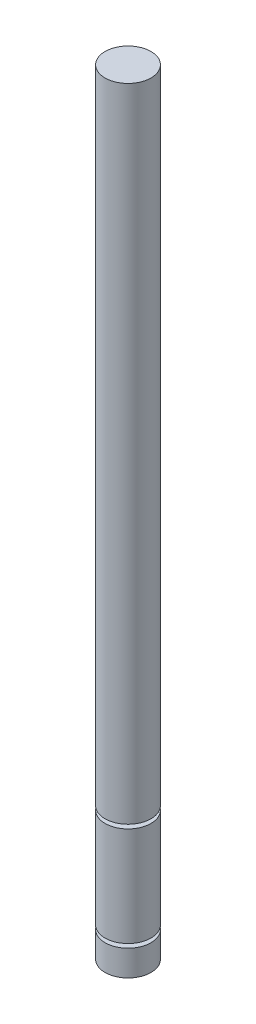
ISO-10303-21;
HEADER;
FILE_DESCRIPTION(('STEP AP214'),'2;1');
FILE_NAME('part.step','',(''),(''),'','','');
FILE_SCHEMA(('AUTOMOTIVE_DESIGN { 1 0 10303 214 1 1 1 1 }'));
ENDSEC;
DATA;
#1=APPLICATION_CONTEXT('core data for automotive mechanical design processes');
#2=APPLICATION_PROTOCOL_DEFINITION('international standard','automotive_design',2000,#1);
#3=PRODUCT_CONTEXT('',#1,'mechanical');
#4=PRODUCT('Part','Part','',(#3));
#5=PRODUCT_RELATED_PRODUCT_CATEGORY('part','',(#4));
#6=PRODUCT_DEFINITION_FORMATION('','',#4);
#7=PRODUCT_DEFINITION_CONTEXT('part definition',#1,'design');
#8=PRODUCT_DEFINITION('design','',#6,#7);
#9=PRODUCT_DEFINITION_SHAPE('','',#8);
#10=(LENGTH_UNIT() NAMED_UNIT(*) SI_UNIT(.MILLI.,.METRE.));
#11=(NAMED_UNIT(*) PLANE_ANGLE_UNIT() SI_UNIT($,.RADIAN.));
#12=(NAMED_UNIT(*) SI_UNIT($,.STERADIAN.) SOLID_ANGLE_UNIT());
#13=UNCERTAINTY_MEASURE_WITH_UNIT(LENGTH_MEASURE(1.E-05),#10,'distance_accuracy_value','');
#14=(GEOMETRIC_REPRESENTATION_CONTEXT(3) GLOBAL_UNCERTAINTY_ASSIGNED_CONTEXT((#13)) GLOBAL_UNIT_ASSIGNED_CONTEXT((#10,
#11,#12)) REPRESENTATION_CONTEXT('',''));
#15=CARTESIAN_POINT('',(0.,0.,0.));
#16=DIRECTION('',(0.,0.,1.));
#17=DIRECTION('',(1.,0.,0.));
#18=AXIS2_PLACEMENT_3D('',#15,#16,#17);
#19=CARTESIAN_POINT('',(0.,135.,0.));
#20=DIRECTION('',(0.,-1.,0.));
#21=DIRECTION('',(0.,0.,-1.));
#22=AXIS2_PLACEMENT_3D('',#19,#20,#21);
#23=CYLINDRICAL_SURFACE('',#22,4.);
#24=CARTESIAN_POINT('',(0.,5.20000000000001,0.));
#25=DIRECTION('',(0.,-1.,0.));
#26=DIRECTION('',(0.,0.,-1.));
#27=AXIS2_PLACEMENT_3D('',#24,#25,#26);
#28=CIRCLE('',#27,4.);
#29=CARTESIAN_POINT('',(0.,5.20000000000001,-4.));
#30=VERTEX_POINT('',#29);
#31=EDGE_CURVE('E57',#30,#30,#28,.T.);
#32=ORIENTED_EDGE('',*,*,#31,.F.);
#33=EDGE_LOOP('',(#32));
#34=FACE_BOUND('',#33,.T.);
#35=CARTESIAN_POINT('',(0.,22.5,0.));
#36=DIRECTION('',(0.,-1.,0.));
#37=DIRECTION('',(0.,0.,-1.));
#38=AXIS2_PLACEMENT_3D('',#35,#36,#37);
#39=CIRCLE('',#38,3.99999999999998);
#40=CARTESIAN_POINT('',(0.,22.5,-3.99999999999998));
#41=VERTEX_POINT('',#40);
#42=EDGE_CURVE('E60',#41,#41,#39,.T.);
#43=ORIENTED_EDGE('',*,*,#42,.T.);
#44=EDGE_LOOP('',(#43));
#45=FACE_BOUND('',#44,.T.);
#46=ADVANCED_FACE('F36',(#34,#45),#23,.T.);
#47=CARTESIAN_POINT('',(0.,0.,0.));
#48=DIRECTION('',(0.,1.,0.));
#49=DIRECTION('',(0.,0.,1.));
#50=AXIS2_PLACEMENT_3D('',#47,#48,#49);
#51=CIRCLE('',#50,4.);
#52=CARTESIAN_POINT('',(0.,0.,4.));
#53=VERTEX_POINT('',#52);
#54=EDGE_CURVE('E40',#53,#53,#51,.T.);
#55=ORIENTED_EDGE('',*,*,#54,.T.);
#56=EDGE_LOOP('',(#55));
#57=FACE_BOUND('',#56,.T.);
#58=CARTESIAN_POINT('',(0.,4.50000000000001,0.));
#59=DIRECTION('',(0.,-1.,0.));
#60=DIRECTION('',(0.,0.,-1.));
#61=AXIS2_PLACEMENT_3D('',#58,#59,#60);
#62=CIRCLE('',#61,3.99999999999998);
#63=CARTESIAN_POINT('',(0.,4.50000000000001,-3.99999999999998));
#64=VERTEX_POINT('',#63);
#65=EDGE_CURVE('E47',#64,#64,#62,.T.);
#66=ORIENTED_EDGE('',*,*,#65,.T.);
#67=EDGE_LOOP('',(#66));
#68=FACE_BOUND('',#67,.T.);
#69=ADVANCED_FACE('F38',(#57,#68),#23,.T.);
#70=CARTESIAN_POINT('',(0.,0.,0.));
#71=DIRECTION('',(0.,1.,0.));
#72=DIRECTION('',(0.,0.,1.));
#73=AXIS2_PLACEMENT_3D('',#70,#71,#72);
#74=PLANE('',#73);
#75=ORIENTED_EDGE('',*,*,#54,.F.);
#76=EDGE_LOOP('',(#75));
#77=FACE_BOUND('',#76,.T.);
#78=ADVANCED_FACE('F85',(#77),#74,.F.);
#79=CARTESIAN_POINT('',(-3.99999999999998,4.50000000000001,0.));
#80=DIRECTION('',(0.,1.,0.));
#81=DIRECTION('',(0.,0.,1.));
#82=AXIS2_PLACEMENT_3D('',#79,#80,#81);
#83=PLANE('',#82);
#84=CARTESIAN_POINT('',(0.,4.50000000000001,0.));
#85=DIRECTION('',(0.,-1.,0.));
#86=DIRECTION('',(0.,0.,-1.));
#87=AXIS2_PLACEMENT_3D('',#84,#85,#86);
#88=CIRCLE('',#87,3.00000000000002);
#89=CARTESIAN_POINT('',(0.,4.50000000000001,-3.00000000000002));
#90=VERTEX_POINT('',#89);
#91=EDGE_CURVE('E51',#90,#90,#88,.T.);
#92=ORIENTED_EDGE('',*,*,#91,.T.);
#93=EDGE_LOOP('',(#92));
#94=FACE_BOUND('',#93,.T.);
#95=ORIENTED_EDGE('',*,*,#65,.F.);
#96=EDGE_LOOP('',(#95));
#97=FACE_BOUND('',#96,.T.);
#98=ADVANCED_FACE('F114',(#94,#97),#83,.T.);
#99=CARTESIAN_POINT('',(0.,0.,0.));
#100=DIRECTION('',(0.,-1.,0.));
#101=DIRECTION('',(0.,0.,-1.));
#102=AXIS2_PLACEMENT_3D('',#99,#100,#101);
#103=CYLINDRICAL_SURFACE('',#102,3.00000000000001);
#104=CARTESIAN_POINT('',(0.,5.20000000000001,0.));
#105=DIRECTION('',(0.,-1.,0.));
#106=DIRECTION('',(0.,0.,-1.));
#107=AXIS2_PLACEMENT_3D('',#104,#105,#106);
#108=CIRCLE('',#107,3.);
#109=CARTESIAN_POINT('',(0.,5.20000000000001,-3.));
#110=VERTEX_POINT('',#109);
#111=EDGE_CURVE('E54',#110,#110,#108,.T.);
#112=ORIENTED_EDGE('',*,*,#111,.T.);
#113=EDGE_LOOP('',(#112));
#114=FACE_BOUND('',#113,.T.);
#115=ORIENTED_EDGE('',*,*,#91,.F.);
#116=EDGE_LOOP('',(#115));
#117=FACE_BOUND('',#116,.T.);
#118=ADVANCED_FACE('F107',(#114,#117),#103,.T.);
#119=CARTESIAN_POINT('',(-4.,5.20000000000001,0.));
#120=DIRECTION('',(0.,-1.,0.));
#121=DIRECTION('',(0.,0.,-1.));
#122=AXIS2_PLACEMENT_3D('',#119,#120,#121);
#123=PLANE('',#122);
#124=ORIENTED_EDGE('',*,*,#31,.T.);
#125=EDGE_LOOP('',(#124));
#126=FACE_BOUND('',#125,.T.);
#127=ORIENTED_EDGE('',*,*,#111,.F.);
#128=EDGE_LOOP('',(#127));
#129=FACE_BOUND('',#128,.T.);
#130=ADVANCED_FACE('F98',(#126,#129),#123,.T.);
#131=CARTESIAN_POINT('',(-3.99999999999998,22.5,0.));
#132=DIRECTION('',(0.,1.,0.));
#133=DIRECTION('',(0.,0.,1.));
#134=AXIS2_PLACEMENT_3D('',#131,#132,#133);
#135=PLANE('',#134);
#136=CARTESIAN_POINT('',(0.,22.5,0.));
#137=DIRECTION('',(0.,-1.,0.));
#138=DIRECTION('',(0.,0.,-1.));
#139=AXIS2_PLACEMENT_3D('',#136,#137,#138);
#140=CIRCLE('',#139,3.00000000000002);
#141=CARTESIAN_POINT('',(0.,22.5,-3.00000000000002));
#142=VERTEX_POINT('',#141);
#143=EDGE_CURVE('E63',#142,#142,#140,.T.);
#144=ORIENTED_EDGE('',*,*,#143,.T.);
#145=EDGE_LOOP('',(#144));
#146=FACE_BOUND('',#145,.T.);
#147=ORIENTED_EDGE('',*,*,#42,.F.);
#148=EDGE_LOOP('',(#147));
#149=FACE_BOUND('',#148,.T.);
#150=ADVANCED_FACE('F95',(#146,#149),#135,.T.);
#151=CARTESIAN_POINT('',(0.,18.,0.));
#152=DIRECTION('',(0.,-1.,0.));
#153=DIRECTION('',(0.,0.,-1.));
#154=AXIS2_PLACEMENT_3D('',#151,#152,#153);
#155=CYLINDRICAL_SURFACE('',#154,3.00000000000001);
#156=CARTESIAN_POINT('',(0.,23.2,0.));
#157=DIRECTION('',(0.,-1.,0.));
#158=DIRECTION('',(0.,0.,-1.));
#159=AXIS2_PLACEMENT_3D('',#156,#157,#158);
#160=CIRCLE('',#159,3.);
#161=CARTESIAN_POINT('',(0.,23.2,-3.));
#162=VERTEX_POINT('',#161);
#163=EDGE_CURVE('E66',#162,#162,#160,.T.);
#164=ORIENTED_EDGE('',*,*,#163,.T.);
#165=EDGE_LOOP('',(#164));
#166=FACE_BOUND('',#165,.T.);
#167=ORIENTED_EDGE('',*,*,#143,.F.);
#168=EDGE_LOOP('',(#167));
#169=FACE_BOUND('',#168,.T.);
#170=ADVANCED_FACE('F97',(#166,#169),#155,.T.);
#171=CARTESIAN_POINT('',(-4.,23.2,0.));
#172=DIRECTION('',(0.,-1.,0.));
#173=DIRECTION('',(0.,0.,-1.));
#174=AXIS2_PLACEMENT_3D('',#171,#172,#173);
#175=PLANE('',#174);
#176=CARTESIAN_POINT('',(0.,23.2,0.));
#177=DIRECTION('',(0.,-1.,0.));
#178=DIRECTION('',(0.,0.,-1.));
#179=AXIS2_PLACEMENT_3D('',#176,#177,#178);
#180=CIRCLE('',#179,4.);
#181=CARTESIAN_POINT('',(0.,23.2,-4.));
#182=VERTEX_POINT('',#181);
#183=EDGE_CURVE('E69',#182,#182,#180,.T.);
#184=ORIENTED_EDGE('',*,*,#183,.T.);
#185=EDGE_LOOP('',(#184));
#186=FACE_BOUND('',#185,.T.);
#187=ORIENTED_EDGE('',*,*,#163,.F.);
#188=EDGE_LOOP('',(#187));
#189=FACE_BOUND('',#188,.T.);
#190=ADVANCED_FACE('F73',(#186,#189),#175,.T.);
#191=CARTESIAN_POINT('',(0.,135.,0.));
#192=DIRECTION('',(0.,1.,0.));
#193=DIRECTION('',(0.,0.,1.));
#194=AXIS2_PLACEMENT_3D('',#191,#192,#193);
#195=PLANE('',#194);
#196=CARTESIAN_POINT('',(0.,135.,0.));
#197=DIRECTION('',(0.,1.,0.));
#198=DIRECTION('',(0.,0.,1.));
#199=AXIS2_PLACEMENT_3D('',#196,#197,#198);
#200=CIRCLE('',#199,4.);
#201=CARTESIAN_POINT('',(0.,135.,4.));
#202=VERTEX_POINT('',#201);
#203=EDGE_CURVE('E10',#202,#202,#200,.T.);
#204=ORIENTED_EDGE('',*,*,#203,.T.);
#205=EDGE_LOOP('',(#204));
#206=FACE_BOUND('',#205,.T.);
#207=ADVANCED_FACE('F78',(#206),#195,.T.);
#208=ORIENTED_EDGE('',*,*,#203,.F.);
#209=EDGE_LOOP('',(#208));
#210=FACE_BOUND('',#209,.T.);
#211=ORIENTED_EDGE('',*,*,#183,.F.);
#212=EDGE_LOOP('',(#211));
#213=FACE_BOUND('',#212,.T.);
#214=ADVANCED_FACE('F76',(#210,#213),#23,.T.);
#215=CLOSED_SHELL('',(#46,#69,#78,#98,#118,#130,#150,#170,#190,#207,#214));
#216=MANIFOLD_SOLID_BREP('B2',#215);
#217=ADVANCED_BREP_SHAPE_REPRESENTATION('',(#18,#216),#14);
#218=SHAPE_DEFINITION_REPRESENTATION(#9,#217);
ENDSEC;
END-ISO-10303-21;
